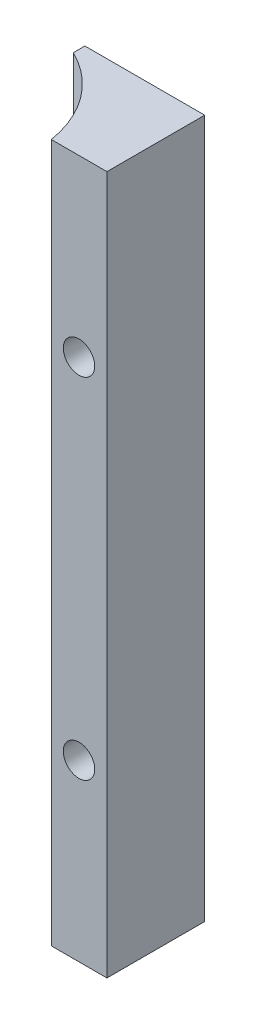
ISO-10303-21;
HEADER;
FILE_DESCRIPTION(('STEP AP214'),'2;1');
FILE_NAME('part.step','',(''),(''),'','','');
FILE_SCHEMA(('AUTOMOTIVE_DESIGN { 1 0 10303 214 1 1 1 1 }'));
ENDSEC;
DATA;
#1=APPLICATION_CONTEXT('core data for automotive mechanical design processes');
#2=APPLICATION_PROTOCOL_DEFINITION('international standard','automotive_design',2000,#1);
#3=PRODUCT_CONTEXT('',#1,'mechanical');
#4=PRODUCT('Part','Part','',(#3));
#5=PRODUCT_RELATED_PRODUCT_CATEGORY('part','',(#4));
#6=PRODUCT_DEFINITION_FORMATION('','',#4);
#7=PRODUCT_DEFINITION_CONTEXT('part definition',#1,'design');
#8=PRODUCT_DEFINITION('design','',#6,#7);
#9=PRODUCT_DEFINITION_SHAPE('','',#8);
#10=(LENGTH_UNIT() NAMED_UNIT(*) SI_UNIT(.MILLI.,.METRE.));
#11=(NAMED_UNIT(*) PLANE_ANGLE_UNIT() SI_UNIT($,.RADIAN.));
#12=(NAMED_UNIT(*) SI_UNIT($,.STERADIAN.) SOLID_ANGLE_UNIT());
#13=UNCERTAINTY_MEASURE_WITH_UNIT(LENGTH_MEASURE(1.E-05),#10,'distance_accuracy_value','');
#14=(GEOMETRIC_REPRESENTATION_CONTEXT(3) GLOBAL_UNCERTAINTY_ASSIGNED_CONTEXT((#13)) GLOBAL_UNIT_ASSIGNED_CONTEXT((#10,
#11,#12)) REPRESENTATION_CONTEXT('',''));
#15=CARTESIAN_POINT('',(0.,0.,0.));
#16=DIRECTION('',(0.,0.,1.));
#17=DIRECTION('',(1.,0.,0.));
#18=AXIS2_PLACEMENT_3D('',#15,#16,#17);
#19=CARTESIAN_POINT('',(-4.78,60.,0.));
#20=DIRECTION('',(0.,0.,-1.));
#21=DIRECTION('',(-1.,0.,0.));
#22=AXIS2_PLACEMENT_3D('',#19,#20,#21);
#23=PLANE('',#22);
#24=CARTESIAN_POINT('',(-2.39999999999999,15.,0.));
#25=DIRECTION('',(0.,0.,1.));
#26=DIRECTION('',(1.,0.,0.));
#27=AXIS2_PLACEMENT_3D('',#24,#25,#26);
#28=CIRCLE('',#27,1.35);
#29=CARTESIAN_POINT('',(-1.05,15.,0.));
#30=VERTEX_POINT('',#29);
#31=EDGE_CURVE('E146',#30,#30,#28,.T.);
#32=ORIENTED_EDGE('',*,*,#31,.F.);
#33=EDGE_LOOP('',(#32));
#34=FACE_BOUND('',#33,.T.);
#35=DIRECTION('',(1.,0.,0.));
#36=VECTOR('',#35,1.);
#37=CARTESIAN_POINT('',(-4.78,0.,0.));
#38=LINE('',#37,#36);
#39=CARTESIAN_POINT('',(-4.78,0.,0.));
#40=VERTEX_POINT('',#39);
#41=CARTESIAN_POINT('',(0.,0.,0.));
#42=VERTEX_POINT('',#41);
#43=EDGE_CURVE('E110',#40,#42,#38,.T.);
#44=ORIENTED_EDGE('',*,*,#43,.T.);
#45=DIRECTION('',(0.,-1.,0.));
#46=VECTOR('',#45,1.);
#47=CARTESIAN_POINT('',(0.,60.,0.));
#48=LINE('',#47,#46);
#49=CARTESIAN_POINT('',(0.,60.,0.));
#50=VERTEX_POINT('',#49);
#51=EDGE_CURVE('E11',#50,#42,#48,.T.);
#52=ORIENTED_EDGE('',*,*,#51,.F.);
#53=DIRECTION('',(1.,0.,0.));
#54=VECTOR('',#53,1.);
#55=CARTESIAN_POINT('',(-4.78,60.,0.));
#56=LINE('',#55,#54);
#57=CARTESIAN_POINT('',(-4.78,60.,0.));
#58=VERTEX_POINT('',#57);
#59=EDGE_CURVE('E119',#58,#50,#56,.T.);
#60=ORIENTED_EDGE('',*,*,#59,.F.);
#61=DIRECTION('',(0.,-1.,0.));
#62=VECTOR('',#61,1.);
#63=CARTESIAN_POINT('',(-4.78,60.,0.));
#64=LINE('',#63,#62);
#65=EDGE_CURVE('E106',#58,#40,#64,.T.);
#66=ORIENTED_EDGE('',*,*,#65,.T.);
#67=EDGE_LOOP('',(#44,#52,#60,#66));
#68=FACE_BOUND('',#67,.T.);
#69=CARTESIAN_POINT('',(-2.4,45.,0.));
#70=DIRECTION('',(0.,0.,1.));
#71=DIRECTION('',(1.,0.,0.));
#72=AXIS2_PLACEMENT_3D('',#69,#70,#71);
#73=CIRCLE('',#72,1.35);
#74=CARTESIAN_POINT('',(-1.05,45.,0.));
#75=VERTEX_POINT('',#74);
#76=EDGE_CURVE('E153',#75,#75,#73,.T.);
#77=ORIENTED_EDGE('',*,*,#76,.F.);
#78=EDGE_LOOP('',(#77));
#79=FACE_BOUND('',#78,.T.);
#80=ADVANCED_FACE('F36',(#34,#68,#79),#23,.F.);
#81=CARTESIAN_POINT('',(0.,60.,0.));
#82=DIRECTION('',(-1.,0.,0.));
#83=DIRECTION('',(0.,0.,1.));
#84=AXIS2_PLACEMENT_3D('',#81,#82,#83);
#85=PLANE('',#84);
#86=DIRECTION('',(0.,0.,-1.));
#87=VECTOR('',#86,1.);
#88=CARTESIAN_POINT('',(0.,0.,0.));
#89=LINE('',#88,#87);
#90=CARTESIAN_POINT('',(0.,0.,-8.4));
#91=VERTEX_POINT('',#90);
#92=EDGE_CURVE('E113',#42,#91,#89,.T.);
#93=ORIENTED_EDGE('',*,*,#92,.T.);
#94=DIRECTION('',(0.,-1.,0.));
#95=VECTOR('',#94,1.);
#96=CARTESIAN_POINT('',(0.,60.,-8.4));
#97=LINE('',#96,#95);
#98=CARTESIAN_POINT('',(0.,60.,-8.4));
#99=VERTEX_POINT('',#98);
#100=EDGE_CURVE('E44',#99,#91,#97,.T.);
#101=ORIENTED_EDGE('',*,*,#100,.F.);
#102=DIRECTION('',(0.,0.,-1.));
#103=VECTOR('',#102,1.);
#104=CARTESIAN_POINT('',(0.,60.,0.));
#105=LINE('',#104,#103);
#106=EDGE_CURVE('E86',#50,#99,#105,.T.);
#107=ORIENTED_EDGE('',*,*,#106,.F.);
#108=ORIENTED_EDGE('',*,*,#51,.T.);
#109=EDGE_LOOP('',(#93,#101,#107,#108));
#110=FACE_BOUND('',#109,.T.);
#111=ADVANCED_FACE('F139',(#110),#85,.F.);
#112=CARTESIAN_POINT('',(0.,60.,-8.4));
#113=DIRECTION('',(0.,0.,1.));
#114=DIRECTION('',(1.,0.,0.));
#115=AXIS2_PLACEMENT_3D('',#112,#113,#114);
#116=PLANE('',#115);
#117=CARTESIAN_POINT('',(-2.4,45.,-8.4));
#118=DIRECTION('',(0.,0.,1.));
#119=DIRECTION('',(1.,0.,0.));
#120=AXIS2_PLACEMENT_3D('',#117,#118,#119);
#121=CIRCLE('',#120,1.35);
#122=CARTESIAN_POINT('',(-1.05,45.,-8.4));
#123=VERTEX_POINT('',#122);
#124=EDGE_CURVE('E148',#123,#123,#121,.T.);
#125=ORIENTED_EDGE('',*,*,#124,.T.);
#126=EDGE_LOOP('',(#125));
#127=FACE_BOUND('',#126,.T.);
#128=CARTESIAN_POINT('',(-2.39999999999999,15.,-8.4));
#129=DIRECTION('',(0.,0.,1.));
#130=DIRECTION('',(1.,0.,0.));
#131=AXIS2_PLACEMENT_3D('',#128,#129,#130);
#132=CIRCLE('',#131,1.35);
#133=CARTESIAN_POINT('',(-1.05,15.,-8.4));
#134=VERTEX_POINT('',#133);
#135=EDGE_CURVE('E114',#134,#134,#132,.T.);
#136=ORIENTED_EDGE('',*,*,#135,.T.);
#137=EDGE_LOOP('',(#136));
#138=FACE_BOUND('',#137,.T.);
#139=DIRECTION('',(-1.,0.,0.));
#140=VECTOR('',#139,1.);
#141=CARTESIAN_POINT('',(0.,0.,-8.4));
#142=LINE('',#141,#140);
#143=CARTESIAN_POINT('',(-10.2922711998618,0.,-8.4));
#144=VERTEX_POINT('',#143);
#145=EDGE_CURVE('E101',#91,#144,#142,.T.);
#146=ORIENTED_EDGE('',*,*,#145,.T.);
#147=DIRECTION('',(0.,-1.,0.));
#148=VECTOR('',#147,1.);
#149=CARTESIAN_POINT('',(-10.2922711998618,60.,-8.4));
#150=LINE('',#149,#148);
#151=CARTESIAN_POINT('',(-10.2922711998618,60.,-8.4));
#152=VERTEX_POINT('',#151);
#153=EDGE_CURVE('E98',#152,#144,#150,.T.);
#154=ORIENTED_EDGE('',*,*,#153,.F.);
#155=DIRECTION('',(-1.,0.,0.));
#156=VECTOR('',#155,1.);
#157=CARTESIAN_POINT('',(0.,60.,-8.4));
#158=LINE('',#157,#156);
#159=EDGE_CURVE('E90',#99,#152,#158,.T.);
#160=ORIENTED_EDGE('',*,*,#159,.F.);
#161=ORIENTED_EDGE('',*,*,#100,.T.);
#162=EDGE_LOOP('',(#146,#154,#160,#161));
#163=FACE_BOUND('',#162,.T.);
#164=ADVANCED_FACE('F99',(#127,#138,#163),#116,.F.);
#165=CARTESIAN_POINT('',(-10.2922711998618,60.,-8.4));
#166=DIRECTION('',(1.,0.,0.));
#167=DIRECTION('',(0.,0.,-1.));
#168=AXIS2_PLACEMENT_3D('',#165,#166,#167);
#169=PLANE('',#168);
#170=DIRECTION('',(0.,0.,1.));
#171=VECTOR('',#170,1.);
#172=CARTESIAN_POINT('',(-10.2922711998618,0.,-8.4));
#173=LINE('',#172,#171);
#174=CARTESIAN_POINT('',(-10.2922711998618,0.,-7.4));
#175=VERTEX_POINT('',#174);
#176=EDGE_CURVE('E72',#144,#175,#173,.T.);
#177=ORIENTED_EDGE('',*,*,#176,.T.);
#178=DIRECTION('',(0.,-1.,0.));
#179=VECTOR('',#178,1.);
#180=CARTESIAN_POINT('',(-10.2922711998618,60.,-7.4));
#181=LINE('',#180,#179);
#182=CARTESIAN_POINT('',(-10.2922711998618,60.,-7.4));
#183=VERTEX_POINT('',#182);
#184=EDGE_CURVE('E102',#183,#175,#181,.T.);
#185=ORIENTED_EDGE('',*,*,#184,.F.);
#186=DIRECTION('',(0.,0.,1.));
#187=VECTOR('',#186,1.);
#188=CARTESIAN_POINT('',(-10.2922711998618,60.,-8.4));
#189=LINE('',#188,#187);
#190=EDGE_CURVE('E94',#152,#183,#189,.T.);
#191=ORIENTED_EDGE('',*,*,#190,.F.);
#192=ORIENTED_EDGE('',*,*,#153,.T.);
#193=EDGE_LOOP('',(#177,#185,#191,#192));
#194=FACE_BOUND('',#193,.T.);
#195=ADVANCED_FACE('F104',(#194),#169,.F.);
#196=CARTESIAN_POINT('',(-14.6511701434025,60.,1.6));
#197=DIRECTION('',(0.,-1.,0.));
#198=DIRECTION('',(0.,0.,-1.));
#199=AXIS2_PLACEMENT_3D('',#196,#197,#198);
#200=CYLINDRICAL_SURFACE('',#199,10.);
#201=CARTESIAN_POINT('',(-14.6511701434025,0.,1.6));
#202=DIRECTION('',(0.,-1.,0.));
#203=DIRECTION('',(0.,0.,-1.));
#204=AXIS2_PLACEMENT_3D('',#201,#202,#203);
#205=CIRCLE('',#204,10.);
#206=EDGE_CURVE('E78',#175,#40,#205,.T.);
#207=ORIENTED_EDGE('',*,*,#206,.T.);
#208=ORIENTED_EDGE('',*,*,#65,.F.);
#209=CARTESIAN_POINT('',(-14.6511701434025,60.,1.6));
#210=DIRECTION('',(0.,-1.,0.));
#211=DIRECTION('',(0.,0.,-1.));
#212=AXIS2_PLACEMENT_3D('',#209,#210,#211);
#213=CIRCLE('',#212,10.);
#214=EDGE_CURVE('E52',#183,#58,#213,.T.);
#215=ORIENTED_EDGE('',*,*,#214,.F.);
#216=ORIENTED_EDGE('',*,*,#184,.T.);
#217=EDGE_LOOP('',(#207,#208,#215,#216));
#218=FACE_BOUND('',#217,.T.);
#219=ADVANCED_FACE('F128',(#218),#200,.F.);
#220=CARTESIAN_POINT('',(-14.6511701434025,60.,1.6));
#221=DIRECTION('',(0.,-1.,0.));
#222=DIRECTION('',(0.,0.,-1.));
#223=AXIS2_PLACEMENT_3D('',#220,#221,#222);
#224=PLANE('',#223);
#225=ORIENTED_EDGE('',*,*,#59,.T.);
#226=ORIENTED_EDGE('',*,*,#106,.T.);
#227=ORIENTED_EDGE('',*,*,#159,.T.);
#228=ORIENTED_EDGE('',*,*,#190,.T.);
#229=ORIENTED_EDGE('',*,*,#214,.T.);
#230=EDGE_LOOP('',(#225,#226,#227,#228,#229));
#231=FACE_BOUND('',#230,.T.);
#232=ADVANCED_FACE('F92',(#231),#224,.F.);
#233=CARTESIAN_POINT('',(-14.6511701434025,0.,1.6));
#234=DIRECTION('',(0.,-1.,0.));
#235=DIRECTION('',(0.,0.,-1.));
#236=AXIS2_PLACEMENT_3D('',#233,#234,#235);
#237=PLANE('',#236);
#238=ORIENTED_EDGE('',*,*,#43,.F.);
#239=ORIENTED_EDGE('',*,*,#206,.F.);
#240=ORIENTED_EDGE('',*,*,#176,.F.);
#241=ORIENTED_EDGE('',*,*,#145,.F.);
#242=ORIENTED_EDGE('',*,*,#92,.F.);
#243=EDGE_LOOP('',(#238,#239,#240,#241,#242));
#244=FACE_BOUND('',#243,.T.);
#245=ADVANCED_FACE('F123',(#244),#237,.T.);
#246=CARTESIAN_POINT('',(-2.39999999999999,15.,0.));
#247=DIRECTION('',(0.,0.,1.));
#248=DIRECTION('',(1.,0.,0.));
#249=AXIS2_PLACEMENT_3D('',#246,#247,#248);
#250=CYLINDRICAL_SURFACE('',#249,1.35);
#251=ORIENTED_EDGE('',*,*,#135,.F.);
#252=EDGE_LOOP('',(#251));
#253=FACE_BOUND('',#252,.T.);
#254=ORIENTED_EDGE('',*,*,#31,.T.);
#255=EDGE_LOOP('',(#254));
#256=FACE_BOUND('',#255,.T.);
#257=ADVANCED_FACE('F162',(#253,#256),#250,.F.);
#258=CARTESIAN_POINT('',(-2.4,45.,0.));
#259=DIRECTION('',(0.,0.,1.));
#260=DIRECTION('',(1.,0.,0.));
#261=AXIS2_PLACEMENT_3D('',#258,#259,#260);
#262=CYLINDRICAL_SURFACE('',#261,1.35);
#263=ORIENTED_EDGE('',*,*,#124,.F.);
#264=EDGE_LOOP('',(#263));
#265=FACE_BOUND('',#264,.T.);
#266=ORIENTED_EDGE('',*,*,#76,.T.);
#267=EDGE_LOOP('',(#266));
#268=FACE_BOUND('',#267,.T.);
#269=ADVANCED_FACE('F160',(#265,#268),#262,.F.);
#270=CLOSED_SHELL('',(#80,#111,#164,#195,#219,#232,#245,#257,#269));
#271=MANIFOLD_SOLID_BREP('B2',#270);
#272=ADVANCED_BREP_SHAPE_REPRESENTATION('',(#18,#271),#14);
#273=SHAPE_DEFINITION_REPRESENTATION(#9,#272);
ENDSEC;
END-ISO-10303-21;
